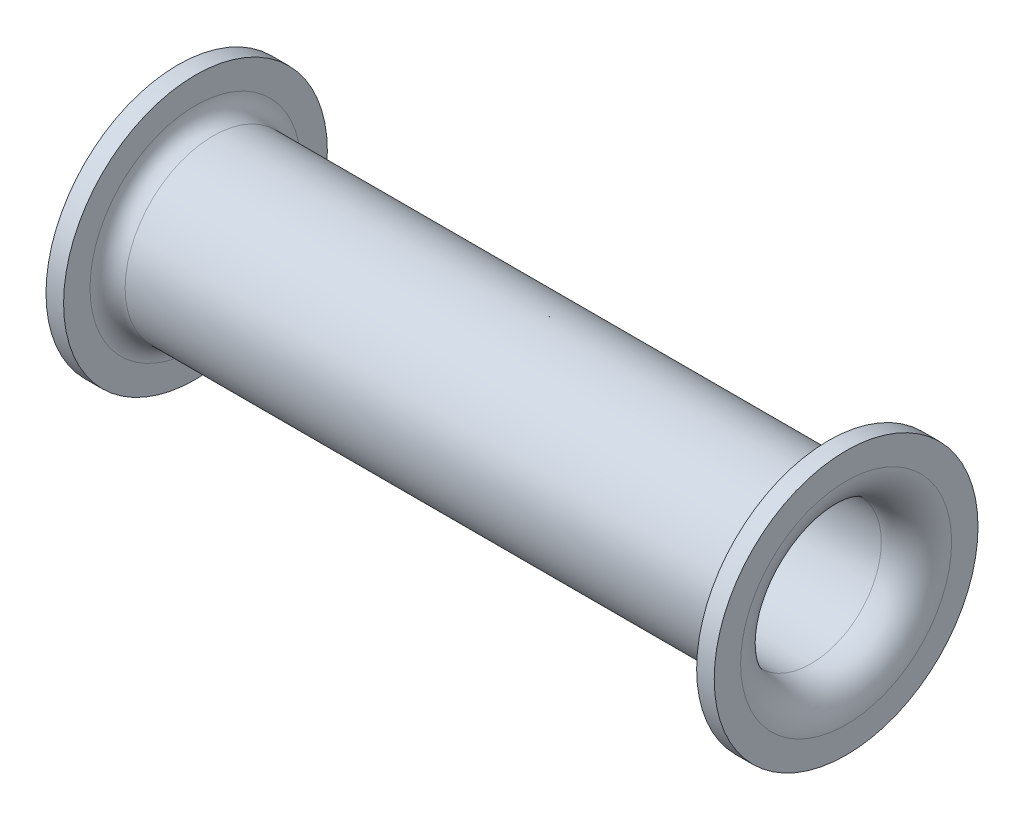
ISO-10303-21;
HEADER;
FILE_DESCRIPTION(('STEP AP214'),'2;1');
FILE_NAME('part.step','',(''),(''),'','','');
FILE_SCHEMA(('AUTOMOTIVE_DESIGN { 1 0 10303 214 1 1 1 1 }'));
ENDSEC;
DATA;
#1=APPLICATION_CONTEXT('core data for automotive mechanical design processes');
#2=APPLICATION_PROTOCOL_DEFINITION('international standard','automotive_design',2000,#1);
#3=PRODUCT_CONTEXT('',#1,'mechanical');
#4=PRODUCT('Part','Part','',(#3));
#5=PRODUCT_RELATED_PRODUCT_CATEGORY('part','',(#4));
#6=PRODUCT_DEFINITION_FORMATION('','',#4);
#7=PRODUCT_DEFINITION_CONTEXT('part definition',#1,'design');
#8=PRODUCT_DEFINITION('design','',#6,#7);
#9=PRODUCT_DEFINITION_SHAPE('','',#8);
#10=(LENGTH_UNIT() NAMED_UNIT(*) SI_UNIT(.MILLI.,.METRE.));
#11=(NAMED_UNIT(*) PLANE_ANGLE_UNIT() SI_UNIT($,.RADIAN.));
#12=(NAMED_UNIT(*) SI_UNIT($,.STERADIAN.) SOLID_ANGLE_UNIT());
#13=UNCERTAINTY_MEASURE_WITH_UNIT(LENGTH_MEASURE(1.E-05),#10,'distance_accuracy_value','');
#14=(GEOMETRIC_REPRESENTATION_CONTEXT(3) GLOBAL_UNCERTAINTY_ASSIGNED_CONTEXT((#13)) GLOBAL_UNIT_ASSIGNED_CONTEXT((#10,
#11,#12)) REPRESENTATION_CONTEXT('',''));
#15=CARTESIAN_POINT('',(0.,0.,0.));
#16=DIRECTION('',(0.,0.,1.));
#17=DIRECTION('',(1.,0.,0.));
#18=AXIS2_PLACEMENT_3D('',#15,#16,#17);
#19=CARTESIAN_POINT('',(-20.,0.,0.));
#20=DIRECTION('',(-1.,0.,0.));
#21=DIRECTION('',(0.,0.,1.));
#22=AXIS2_PLACEMENT_3D('',#19,#20,#21);
#23=CYLINDRICAL_SURFACE('',#22,5.);
#24=CARTESIAN_POINT('',(-17.,0.,0.));
#25=DIRECTION('',(-1.,0.,0.));
#26=DIRECTION('',(0.,0.,1.));
#27=AXIS2_PLACEMENT_3D('',#24,#25,#26);
#28=CIRCLE('',#27,5.);
#29=CARTESIAN_POINT('',(-17.,0.,5.));
#30=VERTEX_POINT('',#29);
#31=EDGE_CURVE('E10',#30,#30,#28,.T.);
#32=ORIENTED_EDGE('',*,*,#31,.F.);
#33=EDGE_LOOP('',(#32));
#34=FACE_BOUND('',#33,.T.);
#35=CARTESIAN_POINT('',(17.,0.,0.));
#36=DIRECTION('',(1.,0.,0.));
#37=DIRECTION('',(0.,0.,-1.));
#38=AXIS2_PLACEMENT_3D('',#35,#36,#37);
#39=CIRCLE('',#38,5.);
#40=CARTESIAN_POINT('',(17.,0.,-5.));
#41=VERTEX_POINT('',#40);
#42=EDGE_CURVE('E42',#41,#41,#39,.T.);
#43=ORIENTED_EDGE('',*,*,#42,.F.);
#44=EDGE_LOOP('',(#43));
#45=FACE_BOUND('',#44,.T.);
#46=ADVANCED_FACE('F30',(#34,#45),#23,.T.);
#47=CARTESIAN_POINT('',(-20.,0.,0.));
#48=DIRECTION('',(-1.,0.,0.));
#49=DIRECTION('',(0.,0.,1.));
#50=AXIS2_PLACEMENT_3D('',#47,#48,#49);
#51=CYLINDRICAL_SURFACE('',#50,4.);
#52=CARTESIAN_POINT('',(-17.,0.,0.));
#53=DIRECTION('',(-1.,0.,0.));
#54=DIRECTION('',(0.,0.,1.));
#55=AXIS2_PLACEMENT_3D('',#52,#53,#54);
#56=CIRCLE('',#55,4.);
#57=CARTESIAN_POINT('',(-17.,0.,4.));
#58=VERTEX_POINT('',#57);
#59=EDGE_CURVE('E37',#58,#58,#56,.F.);
#60=ORIENTED_EDGE('',*,*,#59,.F.);
#61=EDGE_LOOP('',(#60));
#62=FACE_BOUND('',#61,.T.);
#63=CARTESIAN_POINT('',(17.,0.,0.));
#64=DIRECTION('',(1.,0.,0.));
#65=DIRECTION('',(0.,0.,-1.));
#66=AXIS2_PLACEMENT_3D('',#63,#64,#65);
#67=CIRCLE('',#66,4.);
#68=CARTESIAN_POINT('',(17.,0.,-4.));
#69=VERTEX_POINT('',#68);
#70=EDGE_CURVE('E33',#69,#69,#67,.F.);
#71=ORIENTED_EDGE('',*,*,#70,.F.);
#72=EDGE_LOOP('',(#71));
#73=FACE_BOUND('',#72,.T.);
#74=ADVANCED_FACE('F99',(#62,#73),#51,.F.);
#75=CARTESIAN_POINT('',(-17.,0.,0.));
#76=DIRECTION('',(-1.,0.,0.));
#77=DIRECTION('',(0.,0.,1.));
#78=AXIS2_PLACEMENT_3D('',#75,#76,#77);
#79=TOROIDAL_SURFACE('',#78,6.,2.);
#80=ORIENTED_EDGE('',*,*,#59,.T.);
#81=EDGE_LOOP('',(#80));
#82=FACE_BOUND('',#81,.T.);
#83=CARTESIAN_POINT('',(-19.,0.,0.));
#84=DIRECTION('',(-1.,0.,0.));
#85=DIRECTION('',(0.,0.,1.));
#86=AXIS2_PLACEMENT_3D('',#83,#84,#85);
#87=CIRCLE('',#86,6.);
#88=CARTESIAN_POINT('',(-19.,0.,6.));
#89=VERTEX_POINT('',#88);
#90=EDGE_CURVE('E55',#89,#89,#87,.T.);
#91=ORIENTED_EDGE('',*,*,#90,.T.);
#92=EDGE_LOOP('',(#91));
#93=FACE_BOUND('',#92,.T.);
#94=ADVANCED_FACE('F101',(#82,#93),#79,.T.);
#95=CARTESIAN_POINT('',(-17.,0.,0.));
#96=DIRECTION('',(-1.,0.,0.));
#97=DIRECTION('',(0.,0.,1.));
#98=AXIS2_PLACEMENT_3D('',#95,#96,#97);
#99=TOROIDAL_SURFACE('',#98,6.,1.);
#100=CARTESIAN_POINT('',(-18.,0.,0.));
#101=DIRECTION('',(-1.,0.,0.));
#102=DIRECTION('',(0.,0.,1.));
#103=AXIS2_PLACEMENT_3D('',#100,#101,#102);
#104=CIRCLE('',#103,6.);
#105=CARTESIAN_POINT('',(-18.,0.,6.));
#106=VERTEX_POINT('',#105);
#107=EDGE_CURVE('E46',#106,#106,#104,.T.);
#108=ORIENTED_EDGE('',*,*,#107,.F.);
#109=EDGE_LOOP('',(#108));
#110=FACE_BOUND('',#109,.T.);
#111=ORIENTED_EDGE('',*,*,#31,.T.);
#112=EDGE_LOOP('',(#111));
#113=FACE_BOUND('',#112,.T.);
#114=ADVANCED_FACE('F107',(#110,#113),#99,.F.);
#115=CARTESIAN_POINT('',(-18.,7.5,0.));
#116=DIRECTION('',(-1.,0.,0.));
#117=DIRECTION('',(0.,0.,1.));
#118=AXIS2_PLACEMENT_3D('',#115,#116,#117);
#119=PLANE('',#118);
#120=CARTESIAN_POINT('',(-18.,0.,0.));
#121=DIRECTION('',(-1.,0.,0.));
#122=DIRECTION('',(0.,0.,1.));
#123=AXIS2_PLACEMENT_3D('',#120,#121,#122);
#124=CIRCLE('',#123,7.5);
#125=CARTESIAN_POINT('',(-18.,0.,7.5));
#126=VERTEX_POINT('',#125);
#127=EDGE_CURVE('E49',#126,#126,#124,.T.);
#128=ORIENTED_EDGE('',*,*,#127,.F.);
#129=EDGE_LOOP('',(#128));
#130=FACE_BOUND('',#129,.T.);
#131=ORIENTED_EDGE('',*,*,#107,.T.);
#132=EDGE_LOOP('',(#131));
#133=FACE_BOUND('',#132,.T.);
#134=ADVANCED_FACE('F115',(#130,#133),#119,.F.);
#135=CARTESIAN_POINT('',(-20.,0.,0.));
#136=DIRECTION('',(-1.,0.,0.));
#137=DIRECTION('',(0.,0.,1.));
#138=AXIS2_PLACEMENT_3D('',#135,#136,#137);
#139=CYLINDRICAL_SURFACE('',#138,7.5);
#140=CARTESIAN_POINT('',(-19.,0.,0.));
#141=DIRECTION('',(-1.,0.,0.));
#142=DIRECTION('',(0.,0.,1.));
#143=AXIS2_PLACEMENT_3D('',#140,#141,#142);
#144=CIRCLE('',#143,7.5);
#145=CARTESIAN_POINT('',(-19.,0.,7.5));
#146=VERTEX_POINT('',#145);
#147=EDGE_CURVE('E52',#146,#146,#144,.T.);
#148=ORIENTED_EDGE('',*,*,#147,.F.);
#149=EDGE_LOOP('',(#148));
#150=FACE_BOUND('',#149,.T.);
#151=ORIENTED_EDGE('',*,*,#127,.T.);
#152=EDGE_LOOP('',(#151));
#153=FACE_BOUND('',#152,.T.);
#154=ADVANCED_FACE('F119',(#150,#153),#139,.T.);
#155=CARTESIAN_POINT('',(-19.,6.,0.));
#156=DIRECTION('',(1.,0.,0.));
#157=DIRECTION('',(0.,0.,-1.));
#158=AXIS2_PLACEMENT_3D('',#155,#156,#157);
#159=PLANE('',#158);
#160=ORIENTED_EDGE('',*,*,#90,.F.);
#161=EDGE_LOOP('',(#160));
#162=FACE_BOUND('',#161,.T.);
#163=ORIENTED_EDGE('',*,*,#147,.T.);
#164=EDGE_LOOP('',(#163));
#165=FACE_BOUND('',#164,.T.);
#166=ADVANCED_FACE('F94',(#162,#165),#159,.F.);
#167=CARTESIAN_POINT('',(17.,0.,0.));
#168=DIRECTION('',(-1.,0.,0.));
#169=DIRECTION('',(0.,0.,1.));
#170=AXIS2_PLACEMENT_3D('',#167,#168,#169);
#171=TOROIDAL_SURFACE('',#170,6.00000000000001,1.99999999999994);
#172=CARTESIAN_POINT('',(18.9999999999999,0.,0.));
#173=DIRECTION('',(-1.,0.,0.));
#174=DIRECTION('',(0.,0.,1.));
#175=AXIS2_PLACEMENT_3D('',#172,#173,#174);
#176=CIRCLE('',#175,6.00000000000001);
#177=CARTESIAN_POINT('',(18.9999999999999,0.,6.00000000000001));
#178=VERTEX_POINT('',#177);
#179=EDGE_CURVE('E58',#178,#178,#176,.T.);
#180=ORIENTED_EDGE('',*,*,#179,.F.);
#181=EDGE_LOOP('',(#180));
#182=FACE_BOUND('',#181,.T.);
#183=ORIENTED_EDGE('',*,*,#70,.T.);
#184=EDGE_LOOP('',(#183));
#185=FACE_BOUND('',#184,.T.);
#186=ADVANCED_FACE('F88',(#182,#185),#171,.T.);
#187=CARTESIAN_POINT('',(18.9999999999999,6.00000000000001,0.));
#188=DIRECTION('',(-1.,0.,0.));
#189=DIRECTION('',(0.,0.,1.));
#190=AXIS2_PLACEMENT_3D('',#187,#188,#189);
#191=PLANE('',#190);
#192=CARTESIAN_POINT('',(18.9999999999999,0.,0.));
#193=DIRECTION('',(-1.,0.,0.));
#194=DIRECTION('',(0.,0.,1.));
#195=AXIS2_PLACEMENT_3D('',#192,#193,#194);
#196=CIRCLE('',#195,7.5);
#197=CARTESIAN_POINT('',(18.9999999999999,0.,7.5));
#198=VERTEX_POINT('',#197);
#199=EDGE_CURVE('E61',#198,#198,#196,.T.);
#200=ORIENTED_EDGE('',*,*,#199,.F.);
#201=EDGE_LOOP('',(#200));
#202=FACE_BOUND('',#201,.T.);
#203=ORIENTED_EDGE('',*,*,#179,.T.);
#204=EDGE_LOOP('',(#203));
#205=FACE_BOUND('',#204,.T.);
#206=ADVANCED_FACE('F82',(#202,#205),#191,.F.);
#207=CARTESIAN_POINT('',(-20.,0.,0.));
#208=DIRECTION('',(-1.,0.,0.));
#209=DIRECTION('',(0.,0.,1.));
#210=AXIS2_PLACEMENT_3D('',#207,#208,#209);
#211=CYLINDRICAL_SURFACE('',#210,7.5);
#212=CARTESIAN_POINT('',(18.,0.,0.));
#213=DIRECTION('',(-1.,0.,0.));
#214=DIRECTION('',(0.,0.,1.));
#215=AXIS2_PLACEMENT_3D('',#212,#213,#214);
#216=CIRCLE('',#215,7.5);
#217=CARTESIAN_POINT('',(18.,0.,7.5));
#218=VERTEX_POINT('',#217);
#219=EDGE_CURVE('E64',#218,#218,#216,.T.);
#220=ORIENTED_EDGE('',*,*,#219,.F.);
#221=EDGE_LOOP('',(#220));
#222=FACE_BOUND('',#221,.T.);
#223=ORIENTED_EDGE('',*,*,#199,.T.);
#224=EDGE_LOOP('',(#223));
#225=FACE_BOUND('',#224,.T.);
#226=ADVANCED_FACE('F76',(#222,#225),#211,.T.);
#227=CARTESIAN_POINT('',(18.,7.5,0.));
#228=DIRECTION('',(1.,0.,0.));
#229=DIRECTION('',(0.,0.,-1.));
#230=AXIS2_PLACEMENT_3D('',#227,#228,#229);
#231=PLANE('',#230);
#232=CARTESIAN_POINT('',(18.,0.,0.));
#233=DIRECTION('',(-1.,0.,0.));
#234=DIRECTION('',(0.,0.,1.));
#235=AXIS2_PLACEMENT_3D('',#232,#233,#234);
#236=CIRCLE('',#235,6.00000000000001);
#237=CARTESIAN_POINT('',(18.,0.,6.00000000000001));
#238=VERTEX_POINT('',#237);
#239=EDGE_CURVE('E67',#238,#238,#236,.T.);
#240=ORIENTED_EDGE('',*,*,#239,.F.);
#241=EDGE_LOOP('',(#240));
#242=FACE_BOUND('',#241,.T.);
#243=ORIENTED_EDGE('',*,*,#219,.T.);
#244=EDGE_LOOP('',(#243));
#245=FACE_BOUND('',#244,.T.);
#246=ADVANCED_FACE('F73',(#242,#245),#231,.F.);
#247=CARTESIAN_POINT('',(17.,0.,0.));
#248=DIRECTION('',(-1.,0.,0.));
#249=DIRECTION('',(0.,0.,1.));
#250=AXIS2_PLACEMENT_3D('',#247,#248,#249);
#251=TOROIDAL_SURFACE('',#250,6.00000000000001,1.00000000000001);
#252=ORIENTED_EDGE('',*,*,#42,.T.);
#253=EDGE_LOOP('',(#252));
#254=FACE_BOUND('',#253,.T.);
#255=ORIENTED_EDGE('',*,*,#239,.T.);
#256=EDGE_LOOP('',(#255));
#257=FACE_BOUND('',#256,.T.);
#258=ADVANCED_FACE('F71',(#254,#257),#251,.F.);
#259=CLOSED_SHELL('',(#46,#74,#94,#114,#134,#154,#166,#186,#206,#226,#246,#258));
#260=MANIFOLD_SOLID_BREP('B2',#259);
#261=ADVANCED_BREP_SHAPE_REPRESENTATION('',(#18,#260),#14);
#262=SHAPE_DEFINITION_REPRESENTATION(#9,#261);
ENDSEC;
END-ISO-10303-21;
